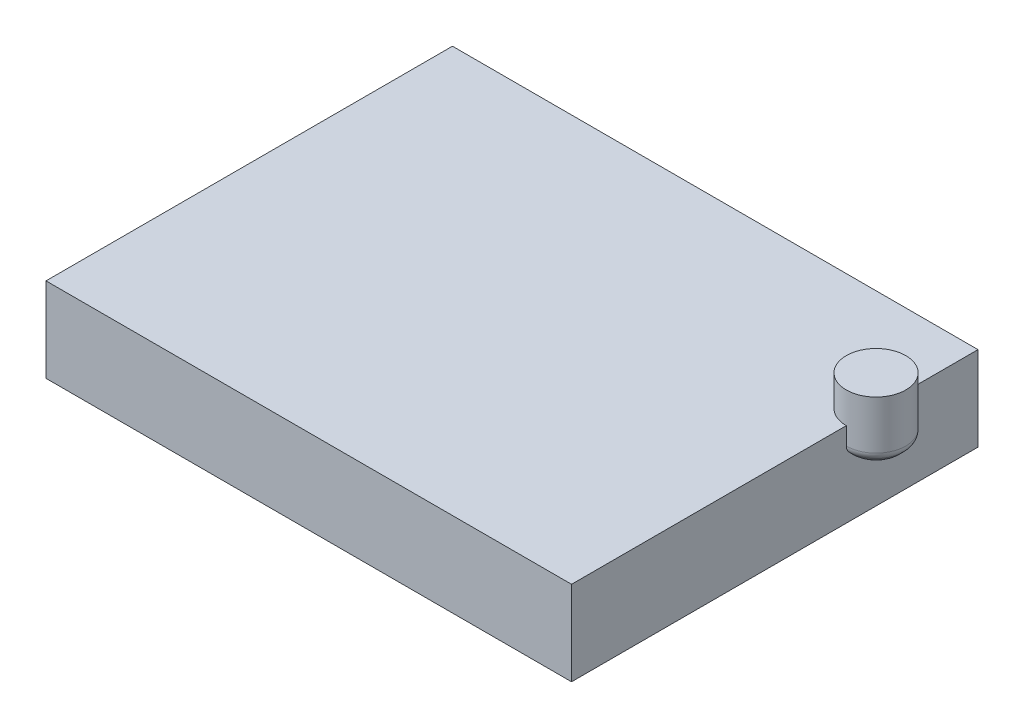
ISO-10303-21;
HEADER;
FILE_DESCRIPTION(('STEP AP214'),'2;1');
FILE_NAME('part.step','',(''),(''),'','','');
FILE_SCHEMA(('AUTOMOTIVE_DESIGN { 1 0 10303 214 1 1 1 1 }'));
ENDSEC;
DATA;
#1=APPLICATION_CONTEXT('core data for automotive mechanical design processes');
#2=APPLICATION_PROTOCOL_DEFINITION('international standard','automotive_design',2000,#1);
#3=PRODUCT_CONTEXT('',#1,'mechanical');
#4=PRODUCT('Part','Part','',(#3));
#5=PRODUCT_RELATED_PRODUCT_CATEGORY('part','',(#4));
#6=PRODUCT_DEFINITION_FORMATION('','',#4);
#7=PRODUCT_DEFINITION_CONTEXT('part definition',#1,'design');
#8=PRODUCT_DEFINITION('design','',#6,#7);
#9=PRODUCT_DEFINITION_SHAPE('','',#8);
#10=(LENGTH_UNIT() NAMED_UNIT(*) SI_UNIT(.MILLI.,.METRE.));
#11=(NAMED_UNIT(*) PLANE_ANGLE_UNIT() SI_UNIT($,.RADIAN.));
#12=(NAMED_UNIT(*) SI_UNIT($,.STERADIAN.) SOLID_ANGLE_UNIT());
#13=UNCERTAINTY_MEASURE_WITH_UNIT(LENGTH_MEASURE(1.E-05),#10,'distance_accuracy_value','');
#14=(GEOMETRIC_REPRESENTATION_CONTEXT(3) GLOBAL_UNCERTAINTY_ASSIGNED_CONTEXT((#13)) GLOBAL_UNIT_ASSIGNED_CONTEXT((#10,
#11,#12)) REPRESENTATION_CONTEXT('',''));
#15=CARTESIAN_POINT('',(0.,0.,0.));
#16=DIRECTION('',(0.,0.,1.));
#17=DIRECTION('',(1.,0.,0.));
#18=AXIS2_PLACEMENT_3D('',#15,#16,#17);
#19=CARTESIAN_POINT('',(0.,14.9391758023677,-34.263280917661));
#20=DIRECTION('',(0.,1.,0.));
#21=DIRECTION('',(0.,0.,1.));
#22=AXIS2_PLACEMENT_3D('',#19,#20,#21);
#23=PLANE('',#22);
#24=CARTESIAN_POINT('',(0.,14.9391758023677,-34.263280917661));
#25=DIRECTION('',(0.,1.,0.));
#26=DIRECTION('',(0.,0.,1.));
#27=AXIS2_PLACEMENT_3D('',#24,#25,#26);
#28=CIRCLE('',#27,5.57865822739027);
#29=CARTESIAN_POINT('',(0.,14.9391758023677,-28.6846226902707));
#30=VERTEX_POINT('',#29);
#31=EDGE_CURVE('E58',#30,#30,#28,.T.);
#32=ORIENTED_EDGE('',*,*,#31,.F.);
#33=EDGE_LOOP('',(#32));
#34=FACE_BOUND('',#33,.T.);
#35=ADVANCED_FACE('F39',(#34),#23,.F.);
#36=CARTESIAN_POINT('',(0.,35.8608241976323,-34.263280917661));
#37=DIRECTION('',(0.,1.,0.));
#38=DIRECTION('',(0.,0.,1.));
#39=AXIS2_PLACEMENT_3D('',#36,#37,#38);
#40=PLANE('',#39);
#41=CARTESIAN_POINT('',(0.,35.8608241976323,-34.263280917661));
#42=DIRECTION('',(0.,1.,0.));
#43=DIRECTION('',(0.,0.,1.));
#44=AXIS2_PLACEMENT_3D('',#41,#42,#43);
#45=CIRCLE('',#44,10.0687862879249);
#46=CARTESIAN_POINT('',(0.,35.8608241976323,-24.1944946297361));
#47=VERTEX_POINT('',#46);
#48=EDGE_CURVE('E11',#47,#47,#45,.T.);
#49=ORIENTED_EDGE('',*,*,#48,.T.);
#50=EDGE_LOOP('',(#49));
#51=FACE_BOUND('',#50,.T.);
#52=ADVANCED_FACE('F66',(#51),#40,.T.);
#53=CARTESIAN_POINT('',(0.,35.8608241976323,-34.263280917661));
#54=DIRECTION('',(0.,1.,0.));
#55=DIRECTION('',(0.,0.,1.));
#56=AXIS2_PLACEMENT_3D('',#53,#54,#55);
#57=CYLINDRICAL_SURFACE('',#56,10.0687862879248);
#58=CARTESIAN_POINT('',(0.,19.4293038629023,-34.263280917661));
#59=DIRECTION('',(0.,1.,0.));
#60=DIRECTION('',(0.,0.,1.));
#61=AXIS2_PLACEMENT_3D('',#58,#59,#60);
#62=CIRCLE('',#61,10.0687862879248);
#63=CARTESIAN_POINT('',(0.,19.4293038629023,-24.1944946297361));
#64=VERTEX_POINT('',#63);
#65=EDGE_CURVE('E45',#64,#64,#62,.T.);
#66=ORIENTED_EDGE('',*,*,#65,.T.);
#67=EDGE_LOOP('',(#66));
#68=FACE_BOUND('',#67,.T.);
#69=ORIENTED_EDGE('',*,*,#48,.F.);
#70=EDGE_LOOP('',(#69));
#71=FACE_BOUND('',#70,.T.);
#72=ADVANCED_FACE('F70',(#68,#71),#57,.T.);
#73=CARTESIAN_POINT('',(0.,19.4293038629022,-34.263280917661));
#74=DIRECTION('',(0.,1.,0.));
#75=DIRECTION('',(0.,0.,1.));
#76=AXIS2_PLACEMENT_3D('',#73,#74,#75);
#77=TOROIDAL_SURFACE('',#76,6.89378628792485,3.175);
#78=ORIENTED_EDGE('',*,*,#65,.F.);
#79=EDGE_LOOP('',(#78));
#80=FACE_BOUND('',#79,.T.);
#81=CARTESIAN_POINT('',(0.,17.1842398326349,-34.263280917661));
#82=DIRECTION('',(0.,1.,0.));
#83=DIRECTION('',(0.,0.,1.));
#84=AXIS2_PLACEMENT_3D('',#81,#82,#83);
#85=CIRCLE('',#84,9.13885031819212);
#86=CARTESIAN_POINT('',(0.,17.1842398326349,-25.1244305994688));
#87=VERTEX_POINT('',#86);
#88=EDGE_CURVE('E49',#87,#87,#85,.T.);
#89=ORIENTED_EDGE('',*,*,#88,.T.);
#90=EDGE_LOOP('',(#89));
#91=FACE_BOUND('',#90,.T.);
#92=ADVANCED_FACE('F74',(#80,#91),#77,.T.);
#93=CARTESIAN_POINT('',(0.,15.8691117721004,-34.263280917661));
#94=DIRECTION('',(0.,1.,0.));
#95=DIRECTION('',(0.,0.,1.));
#96=AXIS2_PLACEMENT_3D('',#93,#94,#95);
#97=CONICAL_SURFACE('',#96,7.82372225765757,0.78539816339745);
#98=ORIENTED_EDGE('',*,*,#88,.F.);
#99=EDGE_LOOP('',(#98));
#100=FACE_BOUND('',#99,.T.);
#101=CARTESIAN_POINT('',(0.,15.8691117721004,-34.263280917661));
#102=DIRECTION('',(0.,1.,0.));
#103=DIRECTION('',(0.,0.,1.));
#104=AXIS2_PLACEMENT_3D('',#101,#102,#103);
#105=CIRCLE('',#104,7.82372225765757);
#106=CARTESIAN_POINT('',(0.,15.8691117721004,-26.4395586600034));
#107=VERTEX_POINT('',#106);
#108=EDGE_CURVE('E53',#107,#107,#105,.T.);
#109=ORIENTED_EDGE('',*,*,#108,.T.);
#110=EDGE_LOOP('',(#109));
#111=FACE_BOUND('',#110,.T.);
#112=ADVANCED_FACE('F79',(#100,#111),#97,.T.);
#113=CARTESIAN_POINT('',(0.,18.1141758023677,-34.263280917661));
#114=DIRECTION('',(0.,1.,0.));
#115=DIRECTION('',(0.,0.,1.));
#116=AXIS2_PLACEMENT_3D('',#113,#114,#115);
#117=TOROIDAL_SURFACE('',#116,5.57865822739028,3.175);
#118=ORIENTED_EDGE('',*,*,#31,.T.);
#119=EDGE_LOOP('',(#118));
#120=FACE_BOUND('',#119,.T.);
#121=ORIENTED_EDGE('',*,*,#108,.F.);
#122=EDGE_LOOP('',(#121));
#123=FACE_BOUND('',#122,.T.);
#124=ADVANCED_FACE('F62',(#120,#123),#117,.T.);
#125=CLOSED_SHELL('',(#35,#52,#72,#92,#112,#124));
#126=MANIFOLD_SOLID_BREP('B2',#125);
#127=CARTESIAN_POINT('',(-177.8,25.4,-68.753532784362));
#128=DIRECTION('',(0.,0.,-1.));
#129=DIRECTION('',(-1.,0.,0.));
#130=AXIS2_PLACEMENT_3D('',#127,#128,#129);
#131=PLANE('',#130);
#132=DIRECTION('',(0.,1.,0.));
#133=VECTOR('',#132,1.);
#134=CARTESIAN_POINT('',(0.,25.4,-68.753532784362));
#135=LINE('',#134,#133);
#136=CARTESIAN_POINT('',(0.,-3.175,-68.753532784362));
#137=VERTEX_POINT('',#136);
#138=CARTESIAN_POINT('',(0.,25.4,-68.753532784362));
#139=VERTEX_POINT('',#138);
#140=EDGE_CURVE('E189',#137,#139,#135,.T.);
#141=ORIENTED_EDGE('',*,*,#140,.F.);
#142=DIRECTION('',(1.,0.,0.));
#143=VECTOR('',#142,1.);
#144=CARTESIAN_POINT('',(-177.8,-3.175,-68.753532784362));
#145=LINE('',#144,#143);
#146=CARTESIAN_POINT('',(-177.8,-3.175,-68.753532784362));
#147=VERTEX_POINT('',#146);
#148=EDGE_CURVE('E37',#147,#137,#145,.T.);
#149=ORIENTED_EDGE('',*,*,#148,.F.);
#150=DIRECTION('',(0.,1.,0.));
#151=VECTOR('',#150,1.);
#152=CARTESIAN_POINT('',(-177.8,25.4,-68.753532784362));
#153=LINE('',#152,#151);
#154=CARTESIAN_POINT('',(-177.8,25.4,-68.753532784362));
#155=VERTEX_POINT('',#154);
#156=EDGE_CURVE('E183',#147,#155,#153,.T.);
#157=ORIENTED_EDGE('',*,*,#156,.T.);
#158=DIRECTION('',(1.,0.,0.));
#159=VECTOR('',#158,1.);
#160=CARTESIAN_POINT('',(-177.8,25.4,-68.753532784362));
#161=LINE('',#160,#159);
#162=EDGE_CURVE('E128',#155,#139,#161,.T.);
#163=ORIENTED_EDGE('',*,*,#162,.T.);
#164=EDGE_LOOP('',(#141,#149,#157,#163));
#165=FACE_BOUND('',#164,.T.);
#166=ADVANCED_FACE('F125',(#165),#131,.T.);
#167=CARTESIAN_POINT('',(-177.8,-3.175,68.753532784362));
#168=DIRECTION('',(0.,-1.,0.));
#169=DIRECTION('',(0.,0.,-1.));
#170=AXIS2_PLACEMENT_3D('',#167,#168,#169);
#171=PLANE('',#170);
#172=DIRECTION('',(0.,0.,-1.));
#173=VECTOR('',#172,1.);
#174=CARTESIAN_POINT('',(0.,-3.175,68.753532784362));
#175=LINE('',#174,#173);
#176=CARTESIAN_POINT('',(0.,-3.175,68.753532784362));
#177=VERTEX_POINT('',#176);
#178=EDGE_CURVE('E185',#177,#137,#175,.T.);
#179=ORIENTED_EDGE('',*,*,#178,.F.);
#180=DIRECTION('',(1.,0.,0.));
#181=VECTOR('',#180,1.);
#182=CARTESIAN_POINT('',(-177.8,-3.175,68.753532784362));
#183=LINE('',#182,#181);
#184=CARTESIAN_POINT('',(-177.8,-3.175,68.753532784362));
#185=VERTEX_POINT('',#184);
#186=EDGE_CURVE('E134',#185,#177,#183,.T.);
#187=ORIENTED_EDGE('',*,*,#186,.F.);
#188=DIRECTION('',(0.,0.,-1.));
#189=VECTOR('',#188,1.);
#190=CARTESIAN_POINT('',(-177.8,-3.175,68.753532784362));
#191=LINE('',#190,#189);
#192=EDGE_CURVE('E180',#185,#147,#191,.T.);
#193=ORIENTED_EDGE('',*,*,#192,.T.);
#194=ORIENTED_EDGE('',*,*,#148,.T.);
#195=EDGE_LOOP('',(#179,#187,#193,#194));
#196=FACE_BOUND('',#195,.T.);
#197=ADVANCED_FACE('F199',(#196),#171,.T.);
#198=CARTESIAN_POINT('',(-177.8,25.4,68.753532784362));
#199=DIRECTION('',(0.,0.,1.));
#200=DIRECTION('',(1.,0.,0.));
#201=AXIS2_PLACEMENT_3D('',#198,#199,#200);
#202=PLANE('',#201);
#203=DIRECTION('',(0.,-1.,0.));
#204=VECTOR('',#203,1.);
#205=CARTESIAN_POINT('',(0.,25.4,68.753532784362));
#206=LINE('',#205,#204);
#207=CARTESIAN_POINT('',(0.,25.4,68.753532784362));
#208=VERTEX_POINT('',#207);
#209=EDGE_CURVE('E175',#208,#177,#206,.T.);
#210=ORIENTED_EDGE('',*,*,#209,.F.);
#211=DIRECTION('',(1.,0.,0.));
#212=VECTOR('',#211,1.);
#213=CARTESIAN_POINT('',(-177.8,25.4,68.753532784362));
#214=LINE('',#213,#212);
#215=CARTESIAN_POINT('',(-177.8,25.4,68.753532784362));
#216=VERTEX_POINT('',#215);
#217=EDGE_CURVE('E170',#216,#208,#214,.T.);
#218=ORIENTED_EDGE('',*,*,#217,.F.);
#219=DIRECTION('',(0.,-1.,0.));
#220=VECTOR('',#219,1.);
#221=CARTESIAN_POINT('',(-177.8,25.4,68.753532784362));
#222=LINE('',#221,#220);
#223=EDGE_CURVE('E173',#216,#185,#222,.T.);
#224=ORIENTED_EDGE('',*,*,#223,.T.);
#225=ORIENTED_EDGE('',*,*,#186,.T.);
#226=EDGE_LOOP('',(#210,#218,#224,#225));
#227=FACE_BOUND('',#226,.T.);
#228=ADVANCED_FACE('F172',(#227),#202,.T.);
#229=CARTESIAN_POINT('',(-177.8,25.4,68.753532784362));
#230=DIRECTION('',(0.,1.,0.));
#231=DIRECTION('',(0.,0.,1.));
#232=AXIS2_PLACEMENT_3D('',#229,#230,#231);
#233=PLANE('',#232);
#234=DIRECTION('',(0.,0.,1.));
#235=VECTOR('',#234,1.);
#236=CARTESIAN_POINT('',(0.,25.4,68.753532784362));
#237=LINE('',#236,#235);
#238=EDGE_CURVE('E192',#139,#208,#237,.T.);
#239=ORIENTED_EDGE('',*,*,#238,.F.);
#240=ORIENTED_EDGE('',*,*,#162,.F.);
#241=DIRECTION('',(0.,0.,1.));
#242=VECTOR('',#241,1.);
#243=CARTESIAN_POINT('',(-177.8,25.4,68.753532784362));
#244=LINE('',#243,#242);
#245=EDGE_CURVE('E179',#155,#216,#244,.T.);
#246=ORIENTED_EDGE('',*,*,#245,.T.);
#247=ORIENTED_EDGE('',*,*,#217,.T.);
#248=EDGE_LOOP('',(#239,#240,#246,#247));
#249=FACE_BOUND('',#248,.T.);
#250=ADVANCED_FACE('F182',(#249),#233,.T.);
#251=CARTESIAN_POINT('',(-177.8,-3.175,-68.753532784362));
#252=DIRECTION('',(1.,0.,0.));
#253=DIRECTION('',(0.,0.,-1.));
#254=AXIS2_PLACEMENT_3D('',#251,#252,#253);
#255=PLANE('',#254);
#256=ORIENTED_EDGE('',*,*,#156,.F.);
#257=ORIENTED_EDGE('',*,*,#192,.F.);
#258=ORIENTED_EDGE('',*,*,#223,.F.);
#259=ORIENTED_EDGE('',*,*,#245,.F.);
#260=EDGE_LOOP('',(#256,#257,#258,#259));
#261=FACE_BOUND('',#260,.T.);
#262=ADVANCED_FACE('F178',(#261),#255,.F.);
#263=CARTESIAN_POINT('',(0.,-3.175,-68.753532784362));
#264=DIRECTION('',(1.,0.,0.));
#265=DIRECTION('',(0.,0.,-1.));
#266=AXIS2_PLACEMENT_3D('',#263,#264,#265);
#267=PLANE('',#266);
#268=ORIENTED_EDGE('',*,*,#140,.T.);
#269=ORIENTED_EDGE('',*,*,#238,.T.);
#270=ORIENTED_EDGE('',*,*,#209,.T.);
#271=ORIENTED_EDGE('',*,*,#178,.T.);
#272=EDGE_LOOP('',(#268,#269,#270,#271));
#273=FACE_BOUND('',#272,.T.);
#274=ADVANCED_FACE('F198',(#273),#267,.T.);
#275=CLOSED_SHELL('',(#166,#197,#228,#250,#262,#274));
#276=MANIFOLD_SOLID_BREP('B6',#275);
#277=ADVANCED_BREP_SHAPE_REPRESENTATION('',(#18,#126,#276),#14);
#278=SHAPE_DEFINITION_REPRESENTATION(#9,#277);
ENDSEC;
END-ISO-10303-21;
